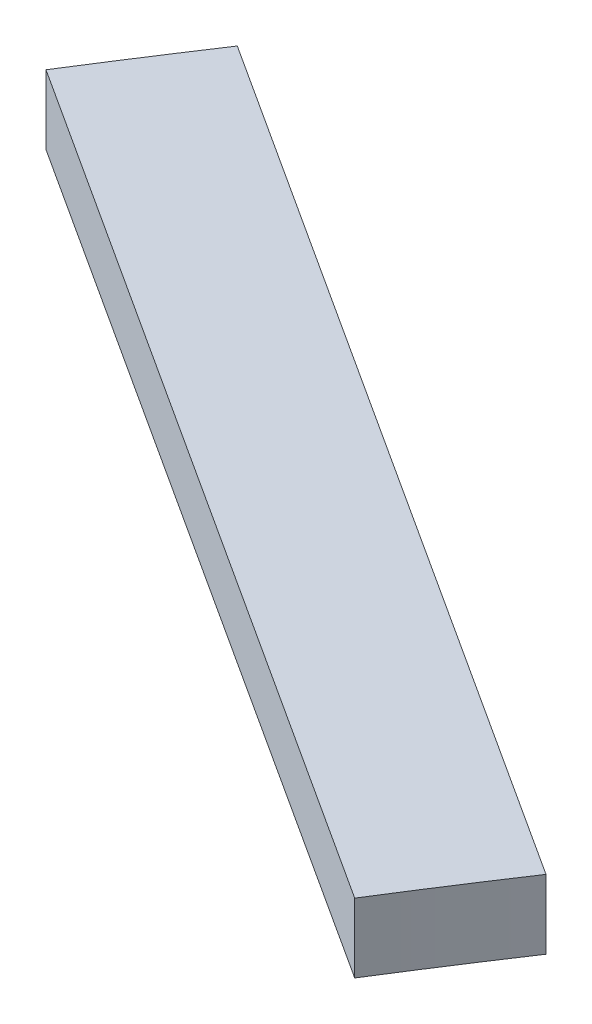
ISO-10303-21;
HEADER;
FILE_DESCRIPTION(('STEP AP214'),'2;1');
FILE_NAME('part.step','',(''),(''),'','','');
FILE_SCHEMA(('AUTOMOTIVE_DESIGN { 1 0 10303 214 1 1 1 1 }'));
ENDSEC;
DATA;
#1=APPLICATION_CONTEXT('core data for automotive mechanical design processes');
#2=APPLICATION_PROTOCOL_DEFINITION('international standard','automotive_design',2000,#1);
#3=PRODUCT_CONTEXT('',#1,'mechanical');
#4=PRODUCT('Part','Part','',(#3));
#5=PRODUCT_RELATED_PRODUCT_CATEGORY('part','',(#4));
#6=PRODUCT_DEFINITION_FORMATION('','',#4);
#7=PRODUCT_DEFINITION_CONTEXT('part definition',#1,'design');
#8=PRODUCT_DEFINITION('design','',#6,#7);
#9=PRODUCT_DEFINITION_SHAPE('','',#8);
#10=(LENGTH_UNIT() NAMED_UNIT(*) SI_UNIT(.MILLI.,.METRE.));
#11=(NAMED_UNIT(*) PLANE_ANGLE_UNIT() SI_UNIT($,.RADIAN.));
#12=(NAMED_UNIT(*) SI_UNIT($,.STERADIAN.) SOLID_ANGLE_UNIT());
#13=UNCERTAINTY_MEASURE_WITH_UNIT(LENGTH_MEASURE(1.E-05),#10,'distance_accuracy_value','');
#14=(GEOMETRIC_REPRESENTATION_CONTEXT(3) GLOBAL_UNCERTAINTY_ASSIGNED_CONTEXT((#13)) GLOBAL_UNIT_ASSIGNED_CONTEXT((#10,
#11,#12)) REPRESENTATION_CONTEXT('',''));
#15=CARTESIAN_POINT('',(0.,0.,0.));
#16=DIRECTION('',(0.,0.,1.));
#17=DIRECTION('',(1.,0.,0.));
#18=AXIS2_PLACEMENT_3D('',#15,#16,#17);
#19=CARTESIAN_POINT('',(-6.28933402318711E-13,7.62,-2.96404258403491E-13));
#20=DIRECTION('',(0.,1.,0.));
#21=DIRECTION('',(0.,0.,1.));
#22=AXIS2_PLACEMENT_3D('',#19,#20,#21);
#23=PLANE('',#22);
#24=DIRECTION('',(0.840025923150771,0.,0.54254626386576));
#25=VECTOR('',#24,1.);
#26=CARTESIAN_POINT('',(-14.9786583076814,7.62,-9.97661485388412));
#27=LINE('',#26,#25);
#28=CARTESIAN_POINT('',(-18.1794201695247,7.62,-12.0438860437464));
#29=VERTEX_POINT('',#28);
#30=CARTESIAN_POINT('',(-14.9786583076814,7.62,-9.97661485388413));
#31=VERTEX_POINT('',#30);
#32=EDGE_CURVE('E59',#29,#31,#27,.T.);
#33=ORIENTED_EDGE('',*,*,#32,.T.);
#34=CARTESIAN_POINT('',(-6.28933402318711E-13,7.62,-2.96404258403491E-13));
#35=DIRECTION('',(0.,1.,0.));
#36=DIRECTION('',(0.,0.,1.));
#37=AXIS2_PLACEMENT_3D('',#34,#35,#36);
#38=CIRCLE('',#37,17.9970288837072);
#39=CARTESIAN_POINT('',(-15.2542718097252,7.62,-9.54988168492354));
#40=VERTEX_POINT('',#39);
#41=EDGE_CURVE('E81',#31,#40,#38,.T.);
#42=ORIENTED_EDGE('',*,*,#41,.T.);
#43=DIRECTION('',(-0.840025923150771,0.,-0.54254626386576));
#44=VECTOR('',#43,1.);
#45=CARTESIAN_POINT('',(-15.2542718097252,7.62,-9.54988168492351));
#46=LINE('',#45,#44);
#47=CARTESIAN_POINT('',(-18.4550336715685,7.62,-11.6171528747858));
#48=VERTEX_POINT('',#47);
#49=EDGE_CURVE('E60',#40,#48,#46,.T.);
#50=ORIENTED_EDGE('',*,*,#49,.T.);
#51=CARTESIAN_POINT('',(-6.28933402318711E-13,7.62,-2.96404258403491E-13));
#52=DIRECTION('',(0.,1.,0.));
#53=DIRECTION('',(0.,0.,1.));
#54=AXIS2_PLACEMENT_3D('',#51,#52,#53);
#55=CIRCLE('',#54,21.8070288837072);
#56=EDGE_CURVE('E20',#29,#48,#55,.T.);
#57=ORIENTED_EDGE('',*,*,#56,.F.);
#58=EDGE_LOOP('',(#33,#42,#50,#57));
#59=FACE_BOUND('',#58,.T.);
#60=ADVANCED_FACE('F17',(#59),#23,.F.);
#61=CARTESIAN_POINT('',(-6.28933402318711E-13,7.874,-2.96404258403491E-13));
#62=DIRECTION('',(0.,1.,0.));
#63=DIRECTION('',(0.,0.,1.));
#64=AXIS2_PLACEMENT_3D('',#61,#62,#63);
#65=CYLINDRICAL_SURFACE('',#64,21.8070288837072);
#66=CARTESIAN_POINT('',(-6.28933402318711E-13,7.874,-2.96404258403491E-13));
#67=DIRECTION('',(0.,1.,0.));
#68=DIRECTION('',(0.,0.,1.));
#69=AXIS2_PLACEMENT_3D('',#66,#67,#68);
#70=CIRCLE('',#69,21.8070288837072);
#71=CARTESIAN_POINT('',(-18.1794201695247,7.874,-12.0438860437464));
#72=VERTEX_POINT('',#71);
#73=CARTESIAN_POINT('',(-18.4550336715685,7.874,-11.6171528747858));
#74=VERTEX_POINT('',#73);
#75=EDGE_CURVE('E68',#72,#74,#70,.T.);
#76=ORIENTED_EDGE('',*,*,#75,.F.);
#77=DIRECTION('',(0.,1.,0.));
#78=VECTOR('',#77,1.);
#79=CARTESIAN_POINT('',(-18.1794201695247,7.874,-12.0438860437464));
#80=LINE('',#79,#78);
#81=EDGE_CURVE('E65',#72,#29,#80,.F.);
#82=ORIENTED_EDGE('',*,*,#81,.T.);
#83=ORIENTED_EDGE('',*,*,#56,.T.);
#84=DIRECTION('',(0.,1.,0.));
#85=VECTOR('',#84,1.);
#86=CARTESIAN_POINT('',(-18.4550336715685,7.874,-11.6171528747858));
#87=LINE('',#86,#85);
#88=EDGE_CURVE('E63',#48,#74,#87,.T.);
#89=ORIENTED_EDGE('',*,*,#88,.T.);
#90=EDGE_LOOP('',(#76,#82,#83,#89));
#91=FACE_BOUND('',#90,.T.);
#92=ADVANCED_FACE('F66',(#91),#65,.T.);
#93=CARTESIAN_POINT('',(-15.2542718097252,7.874,-9.54988168492351));
#94=DIRECTION('',(0.54254626386576,0.,-0.840025923150771));
#95=DIRECTION('',(-0.840025923150771,0.,-0.54254626386576));
#96=AXIS2_PLACEMENT_3D('',#93,#94,#95);
#97=PLANE('',#96);
#98=DIRECTION('',(0.,1.,0.));
#99=VECTOR('',#98,1.);
#100=CARTESIAN_POINT('',(-15.2542718097252,7.874,-9.54988168492355));
#101=LINE('',#100,#99);
#102=CARTESIAN_POINT('',(-15.2542718097252,7.874,-9.54988168492354));
#103=VERTEX_POINT('',#102);
#104=EDGE_CURVE('E79',#40,#103,#101,.T.);
#105=ORIENTED_EDGE('',*,*,#104,.T.);
#106=DIRECTION('',(0.840025923150776,0.,0.542546263865752));
#107=VECTOR('',#106,1.);
#108=CARTESIAN_POINT('',(-18.4550336715685,7.874,-11.6171528747858));
#109=LINE('',#108,#107);
#110=EDGE_CURVE('E73',#74,#103,#109,.T.);
#111=ORIENTED_EDGE('',*,*,#110,.F.);
#112=ORIENTED_EDGE('',*,*,#88,.F.);
#113=ORIENTED_EDGE('',*,*,#49,.F.);
#114=EDGE_LOOP('',(#105,#111,#112,#113));
#115=FACE_BOUND('',#114,.T.);
#116=ADVANCED_FACE('F90',(#115),#97,.F.);
#117=CARTESIAN_POINT('',(-6.28933402318711E-13,7.874,-2.96404258403491E-13));
#118=DIRECTION('',(0.,1.,0.));
#119=DIRECTION('',(0.,0.,1.));
#120=AXIS2_PLACEMENT_3D('',#117,#118,#119);
#121=CYLINDRICAL_SURFACE('',#120,17.9970288837072);
#122=DIRECTION('',(0.,1.,0.));
#123=VECTOR('',#122,1.);
#124=CARTESIAN_POINT('',(-14.9786583076814,7.874,-9.97661485388412));
#125=LINE('',#124,#123);
#126=CARTESIAN_POINT('',(-14.9786583076814,7.874,-9.97661485388413));
#127=VERTEX_POINT('',#126);
#128=EDGE_CURVE('E35',#31,#127,#125,.T.);
#129=ORIENTED_EDGE('',*,*,#128,.T.);
#130=CARTESIAN_POINT('',(-6.28933402318711E-13,7.874,-2.96404258403491E-13));
#131=DIRECTION('',(0.,1.,0.));
#132=DIRECTION('',(0.,0.,1.));
#133=AXIS2_PLACEMENT_3D('',#130,#131,#132);
#134=CIRCLE('',#133,17.9970288837072);
#135=EDGE_CURVE('E26',#103,#127,#134,.F.);
#136=ORIENTED_EDGE('',*,*,#135,.F.);
#137=ORIENTED_EDGE('',*,*,#104,.F.);
#138=ORIENTED_EDGE('',*,*,#41,.F.);
#139=EDGE_LOOP('',(#129,#136,#137,#138));
#140=FACE_BOUND('',#139,.T.);
#141=ADVANCED_FACE('F92',(#140),#121,.F.);
#142=CARTESIAN_POINT('',(-14.9786583076814,7.874,-9.97661485388412));
#143=DIRECTION('',(-0.54254626386576,0.,0.840025923150771));
#144=DIRECTION('',(0.840025923150771,0.,0.54254626386576));
#145=AXIS2_PLACEMENT_3D('',#142,#143,#144);
#146=PLANE('',#145);
#147=ORIENTED_EDGE('',*,*,#81,.F.);
#148=DIRECTION('',(-0.840025923150777,0.,-0.542546263865751));
#149=VECTOR('',#148,1.);
#150=CARTESIAN_POINT('',(-14.9786583076814,7.874,-9.97661485388412));
#151=LINE('',#150,#149);
#152=EDGE_CURVE('E11',#127,#72,#151,.T.);
#153=ORIENTED_EDGE('',*,*,#152,.F.);
#154=ORIENTED_EDGE('',*,*,#128,.F.);
#155=ORIENTED_EDGE('',*,*,#32,.F.);
#156=EDGE_LOOP('',(#147,#153,#154,#155));
#157=FACE_BOUND('',#156,.T.);
#158=ADVANCED_FACE('F71',(#157),#146,.F.);
#159=CARTESIAN_POINT('',(-6.28933402318711E-13,7.874,-2.96404258403491E-13));
#160=DIRECTION('',(0.,1.,0.));
#161=DIRECTION('',(0.,0.,1.));
#162=AXIS2_PLACEMENT_3D('',#159,#160,#161);
#163=PLANE('',#162);
#164=ORIENTED_EDGE('',*,*,#135,.T.);
#165=ORIENTED_EDGE('',*,*,#152,.T.);
#166=ORIENTED_EDGE('',*,*,#75,.T.);
#167=ORIENTED_EDGE('',*,*,#110,.T.);
#168=EDGE_LOOP('',(#164,#165,#166,#167));
#169=FACE_BOUND('',#168,.T.);
#170=ADVANCED_FACE('F89',(#169),#163,.T.);
#171=CLOSED_SHELL('',(#60,#92,#116,#141,#158,#170));
#172=MANIFOLD_SOLID_BREP('B1',#171);
#173=ADVANCED_BREP_SHAPE_REPRESENTATION('',(#18,#172),#14);
#174=SHAPE_DEFINITION_REPRESENTATION(#9,#173);
ENDSEC;
END-ISO-10303-21;
